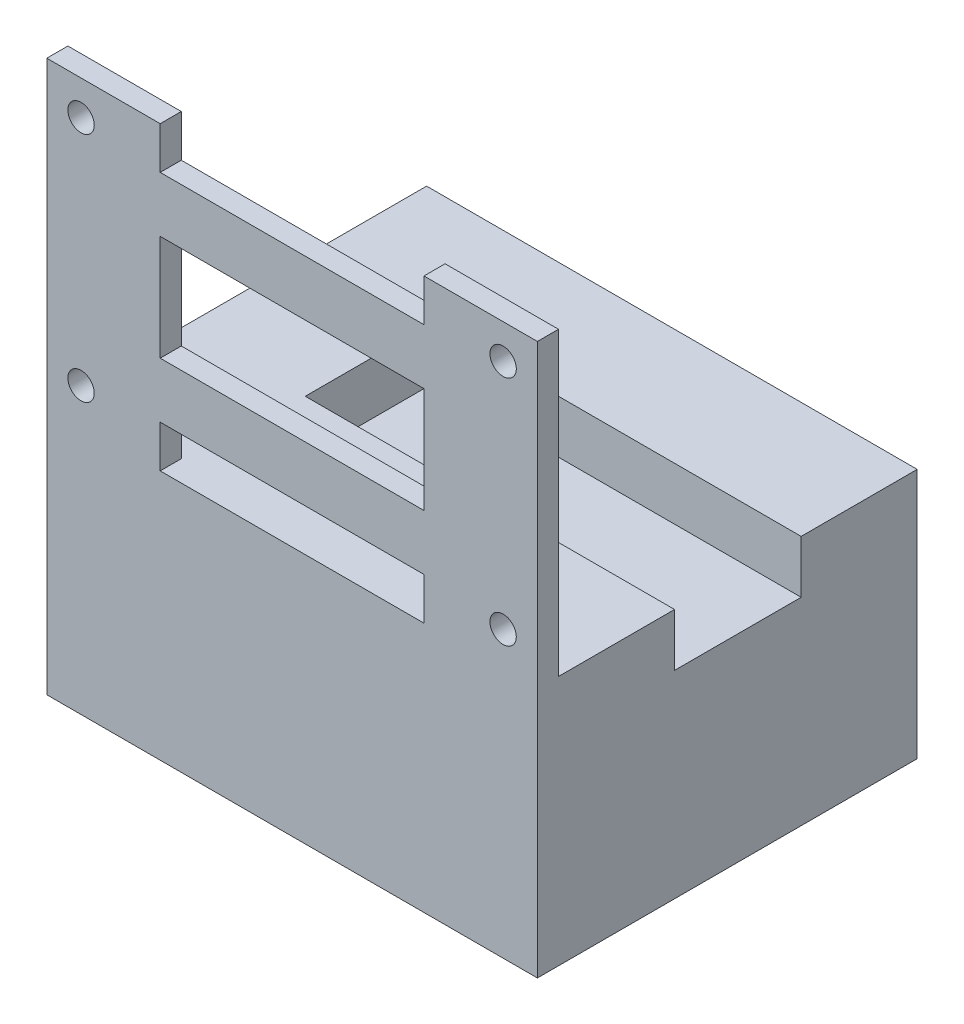
ISO-10303-21;
HEADER;
FILE_DESCRIPTION(('STEP AP214'),'2;1');
FILE_NAME('part.step','',(''),(''),'','','');
FILE_SCHEMA(('AUTOMOTIVE_DESIGN { 1 0 10303 214 1 1 1 1 }'));
ENDSEC;
DATA;
#1=APPLICATION_CONTEXT('core data for automotive mechanical design processes');
#2=APPLICATION_PROTOCOL_DEFINITION('international standard','automotive_design',2000,#1);
#3=PRODUCT_CONTEXT('',#1,'mechanical');
#4=PRODUCT('Part','Part','',(#3));
#5=PRODUCT_RELATED_PRODUCT_CATEGORY('part','',(#4));
#6=PRODUCT_DEFINITION_FORMATION('','',#4);
#7=PRODUCT_DEFINITION_CONTEXT('part definition',#1,'design');
#8=PRODUCT_DEFINITION('design','',#6,#7);
#9=PRODUCT_DEFINITION_SHAPE('','',#8);
#10=(LENGTH_UNIT() NAMED_UNIT(*) SI_UNIT(.MILLI.,.METRE.));
#11=(NAMED_UNIT(*) PLANE_ANGLE_UNIT() SI_UNIT($,.RADIAN.));
#12=(NAMED_UNIT(*) SI_UNIT($,.STERADIAN.) SOLID_ANGLE_UNIT());
#13=UNCERTAINTY_MEASURE_WITH_UNIT(LENGTH_MEASURE(1.E-05),#10,'distance_accuracy_value','');
#14=(GEOMETRIC_REPRESENTATION_CONTEXT(3) GLOBAL_UNCERTAINTY_ASSIGNED_CONTEXT((#13)) GLOBAL_UNIT_ASSIGNED_CONTEXT((#10,
#11,#12)) REPRESENTATION_CONTEXT('',''));
#15=CARTESIAN_POINT('',(0.,0.,0.));
#16=DIRECTION('',(0.,0.,1.));
#17=DIRECTION('',(1.,0.,0.));
#18=AXIS2_PLACEMENT_3D('',#15,#16,#17);
#19=CARTESIAN_POINT('',(-23.25,42.25,19.));
#20=DIRECTION('',(0.,-1.,0.));
#21=DIRECTION('',(0.,0.,-1.));
#22=AXIS2_PLACEMENT_3D('',#19,#20,#21);
#23=PLANE('',#22);
#24=DIRECTION('',(-1.,0.,0.));
#25=VECTOR('',#24,1.);
#26=CARTESIAN_POINT('',(-23.25,42.25,17.));
#27=LINE('',#26,#25);
#28=CARTESIAN_POINT('',(23.25,42.25,17.));
#29=VERTEX_POINT('',#28);
#30=CARTESIAN_POINT('',(12.5,42.25,17.));
#31=VERTEX_POINT('',#30);
#32=EDGE_CURVE('E455',#29,#31,#27,.T.);
#33=ORIENTED_EDGE('',*,*,#32,.T.);
#34=DIRECTION('',(0.,0.,-1.));
#35=VECTOR('',#34,1.);
#36=CARTESIAN_POINT('',(12.5,42.25,27.));
#37=LINE('',#36,#35);
#38=CARTESIAN_POINT('',(12.5,42.25,19.));
#39=VERTEX_POINT('',#38);
#40=EDGE_CURVE('E275',#39,#31,#37,.T.);
#41=ORIENTED_EDGE('',*,*,#40,.F.);
#42=DIRECTION('',(-1.,0.,0.));
#43=VECTOR('',#42,1.);
#44=CARTESIAN_POINT('',(-23.25,42.25,19.));
#45=LINE('',#44,#43);
#46=CARTESIAN_POINT('',(23.25,42.25,19.));
#47=VERTEX_POINT('',#46);
#48=EDGE_CURVE('E459',#47,#39,#45,.T.);
#49=ORIENTED_EDGE('',*,*,#48,.F.);
#50=DIRECTION('',(0.,0.,-1.));
#51=VECTOR('',#50,1.);
#52=CARTESIAN_POINT('',(23.25,42.25,19.));
#53=LINE('',#52,#51);
#54=EDGE_CURVE('E476',#47,#29,#53,.T.);
#55=ORIENTED_EDGE('',*,*,#54,.T.);
#56=EDGE_LOOP('',(#33,#41,#49,#55));
#57=FACE_BOUND('',#56,.T.);
#58=ADVANCED_FACE('F39',(#57),#23,.F.);
#59=CARTESIAN_POINT('',(23.25,13.75,17.));
#60=DIRECTION('',(-1.,0.,0.));
#61=DIRECTION('',(0.,0.,1.));
#62=AXIS2_PLACEMENT_3D('',#59,#60,#61);
#63=PLANE('',#62);
#64=DIRECTION('',(0.,0.,-1.));
#65=VECTOR('',#64,1.);
#66=CARTESIAN_POINT('',(23.25,8.75,-6.));
#67=LINE('',#66,#65);
#68=CARTESIAN_POINT('',(23.25,8.75,6.));
#69=VERTEX_POINT('',#68);
#70=CARTESIAN_POINT('',(23.25,8.75,-6.));
#71=VERTEX_POINT('',#70);
#72=EDGE_CURVE('E335',#69,#71,#67,.T.);
#73=ORIENTED_EDGE('',*,*,#72,.F.);
#74=DIRECTION('',(0.,1.,0.));
#75=VECTOR('',#74,1.);
#76=CARTESIAN_POINT('',(23.25,8.75,6.));
#77=LINE('',#76,#75);
#78=CARTESIAN_POINT('',(23.25,13.75,6.));
#79=VERTEX_POINT('',#78);
#80=EDGE_CURVE('E362',#69,#79,#77,.T.);
#81=ORIENTED_EDGE('',*,*,#80,.T.);
#82=DIRECTION('',(0.,0.,-1.));
#83=VECTOR('',#82,1.);
#84=CARTESIAN_POINT('',(23.25,13.75,17.));
#85=LINE('',#84,#83);
#86=CARTESIAN_POINT('',(23.25,13.75,17.));
#87=VERTEX_POINT('',#86);
#88=EDGE_CURVE('E481',#87,#79,#85,.T.);
#89=ORIENTED_EDGE('',*,*,#88,.F.);
#90=DIRECTION('',(0.,1.,0.));
#91=VECTOR('',#90,1.);
#92=CARTESIAN_POINT('',(23.25,0.,17.));
#93=LINE('',#92,#91);
#94=EDGE_CURVE('E466',#87,#29,#93,.T.);
#95=ORIENTED_EDGE('',*,*,#94,.T.);
#96=ORIENTED_EDGE('',*,*,#54,.F.);
#97=DIRECTION('',(0.,1.,0.));
#98=VECTOR('',#97,1.);
#99=CARTESIAN_POINT('',(23.25,0.,19.));
#100=LINE('',#99,#98);
#101=CARTESIAN_POINT('',(23.25,-10.,19.));
#102=VERTEX_POINT('',#101);
#103=EDGE_CURVE('E454',#102,#47,#100,.T.);
#104=ORIENTED_EDGE('',*,*,#103,.F.);
#105=DIRECTION('',(0.,0.,1.));
#106=VECTOR('',#105,1.);
#107=CARTESIAN_POINT('',(23.25,-10.,0.));
#108=LINE('',#107,#106);
#109=CARTESIAN_POINT('',(23.25,-10.,-17.));
#110=VERTEX_POINT('',#109);
#111=EDGE_CURVE('E308',#110,#102,#108,.T.);
#112=ORIENTED_EDGE('',*,*,#111,.F.);
#113=DIRECTION('',(0.,-1.,0.));
#114=VECTOR('',#113,1.);
#115=CARTESIAN_POINT('',(23.25,13.75,-17.));
#116=LINE('',#115,#114);
#117=CARTESIAN_POINT('',(23.25,13.75,-17.));
#118=VERTEX_POINT('',#117);
#119=EDGE_CURVE('E222',#118,#110,#116,.T.);
#120=ORIENTED_EDGE('',*,*,#119,.F.);
#121=CARTESIAN_POINT('',(23.25,13.75,-6.));
#122=VERTEX_POINT('',#121);
#123=EDGE_CURVE('E480',#122,#118,#85,.T.);
#124=ORIENTED_EDGE('',*,*,#123,.F.);
#125=DIRECTION('',(0.,1.,0.));
#126=VECTOR('',#125,1.);
#127=CARTESIAN_POINT('',(23.25,8.75,-6.));
#128=LINE('',#127,#126);
#129=EDGE_CURVE('E352',#71,#122,#128,.T.);
#130=ORIENTED_EDGE('',*,*,#129,.F.);
#131=EDGE_LOOP('',(#73,#81,#89,#95,#96,#104,#112,#120,#124,#130));
#132=FACE_BOUND('',#131,.T.);
#133=ADVANCED_FACE('F41',(#132),#63,.F.);
#134=CARTESIAN_POINT('',(-23.25,13.75,-17.));
#135=DIRECTION('',(0.,0.,1.));
#136=DIRECTION('',(1.,0.,0.));
#137=AXIS2_PLACEMENT_3D('',#134,#135,#136);
#138=PLANE('',#137);
#139=ORIENTED_EDGE('',*,*,#119,.T.);
#140=DIRECTION('',(1.,0.,0.));
#141=VECTOR('',#140,1.);
#142=CARTESIAN_POINT('',(0.,-10.,-17.));
#143=LINE('',#142,#141);
#144=CARTESIAN_POINT('',(-23.25,-10.,-17.));
#145=VERTEX_POINT('',#144);
#146=EDGE_CURVE('E304',#145,#110,#143,.T.);
#147=ORIENTED_EDGE('',*,*,#146,.F.);
#148=DIRECTION('',(0.,-1.,0.));
#149=VECTOR('',#148,1.);
#150=CARTESIAN_POINT('',(-23.25,13.75,-17.));
#151=LINE('',#150,#149);
#152=CARTESIAN_POINT('',(-23.25,13.75,-17.));
#153=VERTEX_POINT('',#152);
#154=EDGE_CURVE('E217',#153,#145,#151,.T.);
#155=ORIENTED_EDGE('',*,*,#154,.F.);
#156=DIRECTION('',(-1.,0.,0.));
#157=VECTOR('',#156,1.);
#158=CARTESIAN_POINT('',(-23.25,13.75,-17.));
#159=LINE('',#158,#157);
#160=EDGE_CURVE('E483',#118,#153,#159,.T.);
#161=ORIENTED_EDGE('',*,*,#160,.F.);
#162=EDGE_LOOP('',(#139,#147,#155,#161));
#163=FACE_BOUND('',#162,.T.);
#164=ADVANCED_FACE('F493',(#163),#138,.F.);
#165=CARTESIAN_POINT('',(-23.25,13.75,17.));
#166=DIRECTION('',(1.,0.,0.));
#167=DIRECTION('',(0.,0.,-1.));
#168=AXIS2_PLACEMENT_3D('',#165,#166,#167);
#169=PLANE('',#168);
#170=ORIENTED_EDGE('',*,*,#154,.T.);
#171=DIRECTION('',(0.,0.,-1.));
#172=VECTOR('',#171,1.);
#173=CARTESIAN_POINT('',(-23.25,-10.,0.));
#174=LINE('',#173,#172);
#175=CARTESIAN_POINT('',(-23.25,-10.,19.));
#176=VERTEX_POINT('',#175);
#177=EDGE_CURVE('E316',#176,#145,#174,.T.);
#178=ORIENTED_EDGE('',*,*,#177,.F.);
#179=DIRECTION('',(0.,-1.,0.));
#180=VECTOR('',#179,1.);
#181=CARTESIAN_POINT('',(-23.25,0.,19.));
#182=LINE('',#181,#180);
#183=CARTESIAN_POINT('',(-23.25,42.25,19.));
#184=VERTEX_POINT('',#183);
#185=EDGE_CURVE('E451',#184,#176,#182,.T.);
#186=ORIENTED_EDGE('',*,*,#185,.F.);
#187=DIRECTION('',(0.,0.,-1.));
#188=VECTOR('',#187,1.);
#189=CARTESIAN_POINT('',(-23.25,42.25,19.));
#190=LINE('',#189,#188);
#191=CARTESIAN_POINT('',(-23.25,42.25,17.));
#192=VERTEX_POINT('',#191);
#193=EDGE_CURVE('E463',#184,#192,#190,.T.);
#194=ORIENTED_EDGE('',*,*,#193,.T.);
#195=DIRECTION('',(0.,-1.,0.));
#196=VECTOR('',#195,1.);
#197=CARTESIAN_POINT('',(-23.25,0.,17.));
#198=LINE('',#197,#196);
#199=CARTESIAN_POINT('',(-23.25,13.75,17.));
#200=VERTEX_POINT('',#199);
#201=EDGE_CURVE('E447',#192,#200,#198,.T.);
#202=ORIENTED_EDGE('',*,*,#201,.T.);
#203=DIRECTION('',(0.,0.,1.));
#204=VECTOR('',#203,1.);
#205=CARTESIAN_POINT('',(-23.25,13.75,17.));
#206=LINE('',#205,#204);
#207=EDGE_CURVE('E215',#153,#200,#206,.T.);
#208=ORIENTED_EDGE('',*,*,#207,.F.);
#209=EDGE_LOOP('',(#170,#178,#186,#194,#202,#208));
#210=FACE_BOUND('',#209,.T.);
#211=ADVANCED_FACE('F496',(#210),#169,.F.);
#212=CARTESIAN_POINT('',(0.,13.75,0.));
#213=DIRECTION('',(0.,-1.,0.));
#214=DIRECTION('',(0.,0.,-1.));
#215=AXIS2_PLACEMENT_3D('',#212,#213,#214);
#216=PLANE('',#215);
#217=ORIENTED_EDGE('',*,*,#88,.T.);
#218=DIRECTION('',(1.,0.,0.));
#219=VECTOR('',#218,1.);
#220=CARTESIAN_POINT('',(23.25,13.75,6.));
#221=LINE('',#220,#219);
#222=CARTESIAN_POINT('',(-11.75,13.75,6.00000000000001));
#223=VERTEX_POINT('',#222);
#224=EDGE_CURVE('E340',#223,#79,#221,.T.);
#225=ORIENTED_EDGE('',*,*,#224,.F.);
#226=DIRECTION('',(0.,0.,1.));
#227=VECTOR('',#226,1.);
#228=CARTESIAN_POINT('',(-11.75,13.75,-5.99999999999999));
#229=LINE('',#228,#227);
#230=CARTESIAN_POINT('',(-11.75,13.75,-5.99999999999999));
#231=VERTEX_POINT('',#230);
#232=EDGE_CURVE('E356',#231,#223,#229,.T.);
#233=ORIENTED_EDGE('',*,*,#232,.F.);
#234=DIRECTION('',(-1.,0.,0.));
#235=VECTOR('',#234,1.);
#236=CARTESIAN_POINT('',(23.25,13.75,-6.));
#237=LINE('',#236,#235);
#238=EDGE_CURVE('E320',#122,#231,#237,.T.);
#239=ORIENTED_EDGE('',*,*,#238,.F.);
#240=ORIENTED_EDGE('',*,*,#123,.T.);
#241=ORIENTED_EDGE('',*,*,#160,.T.);
#242=ORIENTED_EDGE('',*,*,#207,.T.);
#243=DIRECTION('',(1.,0.,0.));
#244=VECTOR('',#243,1.);
#245=CARTESIAN_POINT('',(-23.25,13.75,17.));
#246=LINE('',#245,#244);
#247=CARTESIAN_POINT('',(-12.5,13.75,17.));
#248=VERTEX_POINT('',#247);
#249=EDGE_CURVE('E205',#200,#248,#246,.T.);
#250=ORIENTED_EDGE('',*,*,#249,.T.);
#251=DIRECTION('',(0.,0.,-1.));
#252=VECTOR('',#251,1.);
#253=CARTESIAN_POINT('',(-12.5,13.75,27.));
#254=LINE('',#253,#252);
#255=CARTESIAN_POINT('',(-12.5,13.75,19.));
#256=VERTEX_POINT('',#255);
#257=EDGE_CURVE('E63',#256,#248,#254,.T.);
#258=ORIENTED_EDGE('',*,*,#257,.F.);
#259=DIRECTION('',(-1.,0.,0.));
#260=VECTOR('',#259,1.);
#261=CARTESIAN_POINT('',(0.,13.75,19.));
#262=LINE('',#261,#260);
#263=CARTESIAN_POINT('',(12.5,13.75,19.));
#264=VERTEX_POINT('',#263);
#265=EDGE_CURVE('E241',#264,#256,#262,.T.);
#266=ORIENTED_EDGE('',*,*,#265,.F.);
#267=DIRECTION('',(0.,0.,-1.));
#268=VECTOR('',#267,1.);
#269=CARTESIAN_POINT('',(12.5,13.75,27.));
#270=LINE('',#269,#268);
#271=CARTESIAN_POINT('',(12.5,13.75,17.));
#272=VERTEX_POINT('',#271);
#273=EDGE_CURVE('E199',#264,#272,#270,.T.);
#274=ORIENTED_EDGE('',*,*,#273,.T.);
#275=EDGE_CURVE('E218',#272,#87,#246,.T.);
#276=ORIENTED_EDGE('',*,*,#275,.T.);
#277=EDGE_LOOP('',(#217,#225,#233,#239,#240,#241,#242,#250,#258,#266,#274,#276));
#278=FACE_BOUND('',#277,.T.);
#279=ADVANCED_FACE('F213',(#278),#216,.F.);
#280=CARTESIAN_POINT('',(0.,0.,17.));
#281=DIRECTION('',(0.,0.,-1.));
#282=DIRECTION('',(-1.,0.,0.));
#283=AXIS2_PLACEMENT_3D('',#280,#281,#282);
#284=PLANE('',#283);
#285=DIRECTION('',(0.,-1.,0.));
#286=VECTOR('',#285,1.);
#287=CARTESIAN_POINT('',(12.5,13.75,17.));
#288=LINE('',#287,#286);
#289=CARTESIAN_POINT('',(12.5,17.75,17.));
#290=VERTEX_POINT('',#289);
#291=EDGE_CURVE('E55',#290,#272,#288,.T.);
#292=ORIENTED_EDGE('',*,*,#291,.F.);
#293=DIRECTION('',(1.,0.,0.));
#294=VECTOR('',#293,1.);
#295=CARTESIAN_POINT('',(12.5,17.75,17.));
#296=LINE('',#295,#294);
#297=CARTESIAN_POINT('',(-12.5,17.75,17.));
#298=VERTEX_POINT('',#297);
#299=EDGE_CURVE('E208',#298,#290,#296,.T.);
#300=ORIENTED_EDGE('',*,*,#299,.F.);
#301=DIRECTION('',(0.,1.,0.));
#302=VECTOR('',#301,1.);
#303=CARTESIAN_POINT('',(-12.5,13.75,17.));
#304=LINE('',#303,#302);
#305=EDGE_CURVE('E192',#248,#298,#304,.T.);
#306=ORIENTED_EDGE('',*,*,#305,.F.);
#307=ORIENTED_EDGE('',*,*,#249,.F.);
#308=ORIENTED_EDGE('',*,*,#201,.F.);
#309=CARTESIAN_POINT('',(-12.5,42.25,17.));
#310=VERTEX_POINT('',#309);
#311=EDGE_CURVE('E469',#310,#192,#27,.T.);
#312=ORIENTED_EDGE('',*,*,#311,.F.);
#313=DIRECTION('',(0.,1.,0.));
#314=VECTOR('',#313,1.);
#315=CARTESIAN_POINT('',(-12.5,42.25,17.));
#316=LINE('',#315,#314);
#317=CARTESIAN_POINT('',(-12.5,38.25,17.));
#318=VERTEX_POINT('',#317);
#319=EDGE_CURVE('E271',#318,#310,#316,.T.);
#320=ORIENTED_EDGE('',*,*,#319,.F.);
#321=DIRECTION('',(-1.,0.,0.));
#322=VECTOR('',#321,1.);
#323=CARTESIAN_POINT('',(12.5,38.25,17.));
#324=LINE('',#323,#322);
#325=CARTESIAN_POINT('',(12.5,38.25,17.));
#326=VERTEX_POINT('',#325);
#327=EDGE_CURVE('E267',#326,#318,#324,.T.);
#328=ORIENTED_EDGE('',*,*,#327,.F.);
#329=DIRECTION('',(0.,-1.,0.));
#330=VECTOR('',#329,1.);
#331=CARTESIAN_POINT('',(12.5,42.25,17.));
#332=LINE('',#331,#330);
#333=EDGE_CURVE('E263',#31,#326,#332,.T.);
#334=ORIENTED_EDGE('',*,*,#333,.F.);
#335=ORIENTED_EDGE('',*,*,#32,.F.);
#336=ORIENTED_EDGE('',*,*,#94,.F.);
#337=ORIENTED_EDGE('',*,*,#275,.F.);
#338=EDGE_LOOP('',(#292,#300,#306,#307,#308,#312,#320,#328,#334,#335,#336,#337));
#339=FACE_BOUND('',#338,.T.);
#340=DIRECTION('',(0.,-1.,0.));
#341=VECTOR('',#340,1.);
#342=CARTESIAN_POINT('',(-12.5,33.,17.));
#343=LINE('',#342,#341);
#344=CARTESIAN_POINT('',(-12.5,33.,17.));
#345=VERTEX_POINT('',#344);
#346=CARTESIAN_POINT('',(-12.5,23.,17.));
#347=VERTEX_POINT('',#346);
#348=EDGE_CURVE('E408',#345,#347,#343,.T.);
#349=ORIENTED_EDGE('',*,*,#348,.T.);
#350=DIRECTION('',(1.,0.,0.));
#351=VECTOR('',#350,1.);
#352=CARTESIAN_POINT('',(-12.5,23.,17.));
#353=LINE('',#352,#351);
#354=CARTESIAN_POINT('',(12.5,23.,17.));
#355=VERTEX_POINT('',#354);
#356=EDGE_CURVE('E400',#347,#355,#353,.T.);
#357=ORIENTED_EDGE('',*,*,#356,.T.);
#358=DIRECTION('',(0.,1.,0.));
#359=VECTOR('',#358,1.);
#360=CARTESIAN_POINT('',(12.5,33.,17.));
#361=LINE('',#360,#359);
#362=CARTESIAN_POINT('',(12.5,33.,17.));
#363=VERTEX_POINT('',#362);
#364=EDGE_CURVE('E366',#355,#363,#361,.T.);
#365=ORIENTED_EDGE('',*,*,#364,.T.);
#366=DIRECTION('',(-1.,0.,0.));
#367=VECTOR('',#366,1.);
#368=CARTESIAN_POINT('',(-12.5,33.,17.));
#369=LINE('',#368,#367);
#370=EDGE_CURVE('E404',#363,#345,#369,.T.);
#371=ORIENTED_EDGE('',*,*,#370,.T.);
#372=EDGE_LOOP('',(#349,#357,#365,#371));
#373=FACE_BOUND('',#372,.T.);
#374=CARTESIAN_POINT('',(-20.,17.,17.));
#375=DIRECTION('',(0.,0.,-1.));
#376=DIRECTION('',(-1.,0.,0.));
#377=AXIS2_PLACEMENT_3D('',#374,#375,#376);
#378=CIRCLE('',#377,1.25);
#379=CARTESIAN_POINT('',(-21.25,17.,17.));
#380=VERTEX_POINT('',#379);
#381=EDGE_CURVE('E396',#380,#380,#378,.F.);
#382=ORIENTED_EDGE('',*,*,#381,.T.);
#383=EDGE_LOOP('',(#382));
#384=FACE_BOUND('',#383,.T.);
#385=CARTESIAN_POINT('',(20.,39.,17.));
#386=DIRECTION('',(0.,0.,-1.));
#387=DIRECTION('',(-1.,0.,0.));
#388=AXIS2_PLACEMENT_3D('',#385,#386,#387);
#389=CIRCLE('',#388,1.25);
#390=CARTESIAN_POINT('',(18.75,39.,17.));
#391=VERTEX_POINT('',#390);
#392=EDGE_CURVE('E388',#391,#391,#389,.F.);
#393=ORIENTED_EDGE('',*,*,#392,.T.);
#394=EDGE_LOOP('',(#393));
#395=FACE_BOUND('',#394,.T.);
#396=CARTESIAN_POINT('',(20.,17.,17.));
#397=DIRECTION('',(0.,0.,-1.));
#398=DIRECTION('',(-1.,0.,0.));
#399=AXIS2_PLACEMENT_3D('',#396,#397,#398);
#400=CIRCLE('',#399,1.25);
#401=CARTESIAN_POINT('',(18.75,17.,17.));
#402=VERTEX_POINT('',#401);
#403=EDGE_CURVE('E380',#402,#402,#400,.F.);
#404=ORIENTED_EDGE('',*,*,#403,.T.);
#405=EDGE_LOOP('',(#404));
#406=FACE_BOUND('',#405,.T.);
#407=CARTESIAN_POINT('',(-20.,39.,17.));
#408=DIRECTION('',(0.,0.,-1.));
#409=DIRECTION('',(-1.,0.,0.));
#410=AXIS2_PLACEMENT_3D('',#407,#408,#409);
#411=CIRCLE('',#410,1.25);
#412=CARTESIAN_POINT('',(-21.25,39.,17.));
#413=VERTEX_POINT('',#412);
#414=EDGE_CURVE('E379',#413,#413,#411,.F.);
#415=ORIENTED_EDGE('',*,*,#414,.T.);
#416=EDGE_LOOP('',(#415));
#417=FACE_BOUND('',#416,.T.);
#418=ADVANCED_FACE('F202',(#339,#373,#384,#395,#406,#417),#284,.T.);
#419=CARTESIAN_POINT('',(-12.5,42.25,19.));
#420=VERTEX_POINT('',#419);
#421=EDGE_CURVE('E458',#420,#184,#45,.T.);
#422=ORIENTED_EDGE('',*,*,#421,.F.);
#423=DIRECTION('',(0.,0.,-1.));
#424=VECTOR('',#423,1.);
#425=CARTESIAN_POINT('',(-12.5,42.25,27.));
#426=LINE('',#425,#424);
#427=EDGE_CURVE('E278',#420,#310,#426,.T.);
#428=ORIENTED_EDGE('',*,*,#427,.T.);
#429=ORIENTED_EDGE('',*,*,#311,.T.);
#430=ORIENTED_EDGE('',*,*,#193,.F.);
#431=EDGE_LOOP('',(#422,#428,#429,#430));
#432=FACE_BOUND('',#431,.T.);
#433=ADVANCED_FACE('F510',(#432),#23,.F.);
#434=CARTESIAN_POINT('',(0.,0.,19.));
#435=DIRECTION('',(0.,0.,-1.));
#436=DIRECTION('',(-1.,0.,0.));
#437=AXIS2_PLACEMENT_3D('',#434,#435,#436);
#438=PLANE('',#437);
#439=DIRECTION('',(1.,0.,0.));
#440=VECTOR('',#439,1.);
#441=CARTESIAN_POINT('',(0.,17.75,19.));
#442=LINE('',#441,#440);
#443=CARTESIAN_POINT('',(-12.5,17.75,19.));
#444=VERTEX_POINT('',#443);
#445=CARTESIAN_POINT('',(12.5,17.75,19.));
#446=VERTEX_POINT('',#445);
#447=EDGE_CURVE('E48',#444,#446,#442,.T.);
#448=ORIENTED_EDGE('',*,*,#447,.T.);
#449=DIRECTION('',(0.,-1.,0.));
#450=VECTOR('',#449,1.);
#451=CARTESIAN_POINT('',(12.5,0.,19.));
#452=LINE('',#451,#450);
#453=EDGE_CURVE('E11',#446,#264,#452,.T.);
#454=ORIENTED_EDGE('',*,*,#453,.T.);
#455=ORIENTED_EDGE('',*,*,#265,.T.);
#456=DIRECTION('',(0.,1.,0.));
#457=VECTOR('',#456,1.);
#458=CARTESIAN_POINT('',(-12.5,0.,19.));
#459=LINE('',#458,#457);
#460=EDGE_CURVE('E195',#256,#444,#459,.T.);
#461=ORIENTED_EDGE('',*,*,#460,.T.);
#462=EDGE_LOOP('',(#448,#454,#455,#461));
#463=FACE_BOUND('',#462,.T.);
#464=ORIENTED_EDGE('',*,*,#48,.T.);
#465=DIRECTION('',(0.,-1.,0.));
#466=VECTOR('',#465,1.);
#467=CARTESIAN_POINT('',(12.5,0.,19.));
#468=LINE('',#467,#466);
#469=CARTESIAN_POINT('',(12.5,38.25,19.));
#470=VERTEX_POINT('',#469);
#471=EDGE_CURVE('E237',#39,#470,#468,.T.);
#472=ORIENTED_EDGE('',*,*,#471,.T.);
#473=DIRECTION('',(-1.,0.,0.));
#474=VECTOR('',#473,1.);
#475=CARTESIAN_POINT('',(0.,38.25,19.));
#476=LINE('',#475,#474);
#477=CARTESIAN_POINT('',(-12.5,38.25,19.));
#478=VERTEX_POINT('',#477);
#479=EDGE_CURVE('E229',#470,#478,#476,.T.);
#480=ORIENTED_EDGE('',*,*,#479,.T.);
#481=DIRECTION('',(0.,1.,0.));
#482=VECTOR('',#481,1.);
#483=CARTESIAN_POINT('',(-12.5,0.,19.));
#484=LINE('',#483,#482);
#485=EDGE_CURVE('E233',#478,#420,#484,.T.);
#486=ORIENTED_EDGE('',*,*,#485,.T.);
#487=ORIENTED_EDGE('',*,*,#421,.T.);
#488=ORIENTED_EDGE('',*,*,#185,.T.);
#489=DIRECTION('',(-1.,0.,0.));
#490=VECTOR('',#489,1.);
#491=CARTESIAN_POINT('',(0.,-10.,19.));
#492=LINE('',#491,#490);
#493=EDGE_CURVE('E312',#102,#176,#492,.T.);
#494=ORIENTED_EDGE('',*,*,#493,.F.);
#495=ORIENTED_EDGE('',*,*,#103,.T.);
#496=EDGE_LOOP('',(#464,#472,#480,#486,#487,#488,#494,#495));
#497=FACE_BOUND('',#496,.T.);
#498=DIRECTION('',(1.,0.,0.));
#499=VECTOR('',#498,1.);
#500=CARTESIAN_POINT('',(-12.5,23.,19.));
#501=LINE('',#500,#499);
#502=CARTESIAN_POINT('',(-12.5,23.,19.));
#503=VERTEX_POINT('',#502);
#504=CARTESIAN_POINT('',(12.5,23.,19.));
#505=VERTEX_POINT('',#504);
#506=EDGE_CURVE('E415',#503,#505,#501,.T.);
#507=ORIENTED_EDGE('',*,*,#506,.F.);
#508=DIRECTION('',(0.,-1.,0.));
#509=VECTOR('',#508,1.);
#510=CARTESIAN_POINT('',(-12.5,33.,19.));
#511=LINE('',#510,#509);
#512=CARTESIAN_POINT('',(-12.5,33.,19.));
#513=VERTEX_POINT('',#512);
#514=EDGE_CURVE('E412',#513,#503,#511,.T.);
#515=ORIENTED_EDGE('',*,*,#514,.F.);
#516=DIRECTION('',(-1.,0.,0.));
#517=VECTOR('',#516,1.);
#518=CARTESIAN_POINT('',(-12.5,33.,19.));
#519=LINE('',#518,#517);
#520=CARTESIAN_POINT('',(12.5,33.,19.));
#521=VERTEX_POINT('',#520);
#522=EDGE_CURVE('E423',#521,#513,#519,.T.);
#523=ORIENTED_EDGE('',*,*,#522,.F.);
#524=DIRECTION('',(0.,1.,0.));
#525=VECTOR('',#524,1.);
#526=CARTESIAN_POINT('',(12.5,33.,19.));
#527=LINE('',#526,#525);
#528=EDGE_CURVE('E419',#505,#521,#527,.T.);
#529=ORIENTED_EDGE('',*,*,#528,.F.);
#530=EDGE_LOOP('',(#507,#515,#523,#529));
#531=FACE_BOUND('',#530,.T.);
#532=CARTESIAN_POINT('',(-20.,17.,19.));
#533=DIRECTION('',(0.,0.,1.));
#534=DIRECTION('',(-1.,0.,0.));
#535=AXIS2_PLACEMENT_3D('',#532,#533,#534);
#536=CIRCLE('',#535,1.25);
#537=CARTESIAN_POINT('',(-21.25,17.,19.));
#538=VERTEX_POINT('',#537);
#539=EDGE_CURVE('E392',#538,#538,#536,.T.);
#540=ORIENTED_EDGE('',*,*,#539,.F.);
#541=EDGE_LOOP('',(#540));
#542=FACE_BOUND('',#541,.T.);
#543=CARTESIAN_POINT('',(20.,39.,19.));
#544=DIRECTION('',(0.,0.,1.));
#545=DIRECTION('',(-1.,0.,0.));
#546=AXIS2_PLACEMENT_3D('',#543,#544,#545);
#547=CIRCLE('',#546,1.25);
#548=CARTESIAN_POINT('',(18.75,39.,19.));
#549=VERTEX_POINT('',#548);
#550=EDGE_CURVE('E384',#549,#549,#547,.T.);
#551=ORIENTED_EDGE('',*,*,#550,.F.);
#552=EDGE_LOOP('',(#551));
#553=FACE_BOUND('',#552,.T.);
#554=CARTESIAN_POINT('',(20.,17.,19.));
#555=DIRECTION('',(0.,0.,1.));
#556=DIRECTION('',(1.,0.,0.));
#557=AXIS2_PLACEMENT_3D('',#554,#555,#556);
#558=CIRCLE('',#557,1.25);
#559=CARTESIAN_POINT('',(21.25,17.,19.));
#560=VERTEX_POINT('',#559);
#561=EDGE_CURVE('E375',#560,#560,#558,.T.);
#562=ORIENTED_EDGE('',*,*,#561,.F.);
#563=EDGE_LOOP('',(#562));
#564=FACE_BOUND('',#563,.T.);
#565=CARTESIAN_POINT('',(-20.,39.,19.));
#566=DIRECTION('',(0.,0.,1.));
#567=DIRECTION('',(1.,0.,0.));
#568=AXIS2_PLACEMENT_3D('',#565,#566,#567);
#569=CIRCLE('',#568,1.25);
#570=CARTESIAN_POINT('',(-18.75,39.,19.));
#571=VERTEX_POINT('',#570);
#572=EDGE_CURVE('E443',#571,#571,#569,.T.);
#573=ORIENTED_EDGE('',*,*,#572,.F.);
#574=EDGE_LOOP('',(#573));
#575=FACE_BOUND('',#574,.T.);
#576=ADVANCED_FACE('F248',(#463,#497,#531,#542,#553,#564,#575),#438,.F.);
#577=CARTESIAN_POINT('',(-20.,39.,-17.001));
#578=DIRECTION('',(0.,0.,1.));
#579=DIRECTION('',(1.,0.,0.));
#580=AXIS2_PLACEMENT_3D('',#577,#578,#579);
#581=CYLINDRICAL_SURFACE('',#580,1.25);
#582=ORIENTED_EDGE('',*,*,#414,.F.);
#583=EDGE_LOOP('',(#582));
#584=FACE_BOUND('',#583,.T.);
#585=ORIENTED_EDGE('',*,*,#572,.T.);
#586=EDGE_LOOP('',(#585));
#587=FACE_BOUND('',#586,.T.);
#588=ADVANCED_FACE('F556',(#584,#587),#581,.F.);
#589=CARTESIAN_POINT('',(20.,17.,-17.001));
#590=DIRECTION('',(0.,0.,1.));
#591=DIRECTION('',(1.,0.,0.));
#592=AXIS2_PLACEMENT_3D('',#589,#590,#591);
#593=CYLINDRICAL_SURFACE('',#592,1.25);
#594=ORIENTED_EDGE('',*,*,#403,.F.);
#595=EDGE_LOOP('',(#594));
#596=FACE_BOUND('',#595,.T.);
#597=ORIENTED_EDGE('',*,*,#561,.T.);
#598=EDGE_LOOP('',(#597));
#599=FACE_BOUND('',#598,.T.);
#600=ADVANCED_FACE('F564',(#596,#599),#593,.F.);
#601=CARTESIAN_POINT('',(20.,39.,-17.001));
#602=DIRECTION('',(0.,0.,1.));
#603=DIRECTION('',(1.,0.,0.));
#604=AXIS2_PLACEMENT_3D('',#601,#602,#603);
#605=CYLINDRICAL_SURFACE('',#604,1.25);
#606=ORIENTED_EDGE('',*,*,#392,.F.);
#607=EDGE_LOOP('',(#606));
#608=FACE_BOUND('',#607,.T.);
#609=ORIENTED_EDGE('',*,*,#550,.T.);
#610=EDGE_LOOP('',(#609));
#611=FACE_BOUND('',#610,.T.);
#612=ADVANCED_FACE('F586',(#608,#611),#605,.F.);
#613=CARTESIAN_POINT('',(-20.,17.,-17.001));
#614=DIRECTION('',(0.,0.,1.));
#615=DIRECTION('',(1.,0.,0.));
#616=AXIS2_PLACEMENT_3D('',#613,#614,#615);
#617=CYLINDRICAL_SURFACE('',#616,1.25);
#618=ORIENTED_EDGE('',*,*,#381,.F.);
#619=EDGE_LOOP('',(#618));
#620=FACE_BOUND('',#619,.T.);
#621=ORIENTED_EDGE('',*,*,#539,.T.);
#622=EDGE_LOOP('',(#621));
#623=FACE_BOUND('',#622,.T.);
#624=ADVANCED_FACE('F570',(#620,#623),#617,.F.);
#625=CARTESIAN_POINT('',(-12.5,33.,-17.001));
#626=DIRECTION('',(-1.,0.,0.));
#627=DIRECTION('',(0.,-1.,0.));
#628=AXIS2_PLACEMENT_3D('',#625,#626,#627);
#629=PLANE('',#628);
#630=DIRECTION('',(0.,0.,1.));
#631=VECTOR('',#630,1.);
#632=CARTESIAN_POINT('',(-12.5,33.,-17.001));
#633=LINE('',#632,#631);
#634=EDGE_CURVE('E428',#345,#513,#633,.T.);
#635=ORIENTED_EDGE('',*,*,#634,.T.);
#636=ORIENTED_EDGE('',*,*,#514,.T.);
#637=DIRECTION('',(0.,0.,1.));
#638=VECTOR('',#637,1.);
#639=CARTESIAN_POINT('',(-12.5,23.,-17.001));
#640=LINE('',#639,#638);
#641=EDGE_CURVE('E427',#347,#503,#640,.T.);
#642=ORIENTED_EDGE('',*,*,#641,.F.);
#643=ORIENTED_EDGE('',*,*,#348,.F.);
#644=EDGE_LOOP('',(#635,#636,#642,#643));
#645=FACE_BOUND('',#644,.T.);
#646=ADVANCED_FACE('F566',(#645),#629,.F.);
#647=CARTESIAN_POINT('',(-12.5,33.,-17.001));
#648=DIRECTION('',(0.,1.,0.));
#649=DIRECTION('',(0.,0.,1.));
#650=AXIS2_PLACEMENT_3D('',#647,#648,#649);
#651=PLANE('',#650);
#652=DIRECTION('',(0.,0.,1.));
#653=VECTOR('',#652,1.);
#654=CARTESIAN_POINT('',(12.5,33.,-17.001));
#655=LINE('',#654,#653);
#656=EDGE_CURVE('E431',#363,#521,#655,.T.);
#657=ORIENTED_EDGE('',*,*,#656,.T.);
#658=ORIENTED_EDGE('',*,*,#522,.T.);
#659=ORIENTED_EDGE('',*,*,#634,.F.);
#660=ORIENTED_EDGE('',*,*,#370,.F.);
#661=EDGE_LOOP('',(#657,#658,#659,#660));
#662=FACE_BOUND('',#661,.T.);
#663=ADVANCED_FACE('F569',(#662),#651,.F.);
#664=CARTESIAN_POINT('',(12.5,33.,-17.001));
#665=DIRECTION('',(1.,0.,0.));
#666=DIRECTION('',(0.,1.,0.));
#667=AXIS2_PLACEMENT_3D('',#664,#665,#666);
#668=PLANE('',#667);
#669=DIRECTION('',(0.,0.,1.));
#670=VECTOR('',#669,1.);
#671=CARTESIAN_POINT('',(12.5,23.,-17.001));
#672=LINE('',#671,#670);
#673=EDGE_CURVE('E434',#355,#505,#672,.T.);
#674=ORIENTED_EDGE('',*,*,#673,.T.);
#675=ORIENTED_EDGE('',*,*,#528,.T.);
#676=ORIENTED_EDGE('',*,*,#656,.F.);
#677=ORIENTED_EDGE('',*,*,#364,.F.);
#678=EDGE_LOOP('',(#674,#675,#676,#677));
#679=FACE_BOUND('',#678,.T.);
#680=ADVANCED_FACE('F576',(#679),#668,.F.);
#681=CARTESIAN_POINT('',(-12.5,23.,-17.001));
#682=DIRECTION('',(0.,-1.,0.));
#683=DIRECTION('',(0.,0.,-1.));
#684=AXIS2_PLACEMENT_3D('',#681,#682,#683);
#685=PLANE('',#684);
#686=ORIENTED_EDGE('',*,*,#641,.T.);
#687=ORIENTED_EDGE('',*,*,#506,.T.);
#688=ORIENTED_EDGE('',*,*,#673,.F.);
#689=ORIENTED_EDGE('',*,*,#356,.F.);
#690=EDGE_LOOP('',(#686,#687,#688,#689));
#691=FACE_BOUND('',#690,.T.);
#692=ADVANCED_FACE('F572',(#691),#685,.F.);
#693=CARTESIAN_POINT('',(23.25,8.75,6.));
#694=DIRECTION('',(0.,0.,1.));
#695=DIRECTION('',(1.,0.,0.));
#696=AXIS2_PLACEMENT_3D('',#693,#694,#695);
#697=PLANE('',#696);
#698=ORIENTED_EDGE('',*,*,#224,.T.);
#699=ORIENTED_EDGE('',*,*,#80,.F.);
#700=DIRECTION('',(1.,0.,0.));
#701=VECTOR('',#700,1.);
#702=CARTESIAN_POINT('',(23.25,8.75,6.));
#703=LINE('',#702,#701);
#704=CARTESIAN_POINT('',(-11.75,8.75,6.00000000000001));
#705=VERTEX_POINT('',#704);
#706=EDGE_CURVE('E348',#705,#69,#703,.T.);
#707=ORIENTED_EDGE('',*,*,#706,.F.);
#708=DIRECTION('',(0.,1.,0.));
#709=VECTOR('',#708,1.);
#710=CARTESIAN_POINT('',(-11.75,8.75,6.00000000000001));
#711=LINE('',#710,#709);
#712=EDGE_CURVE('E367',#705,#223,#711,.T.);
#713=ORIENTED_EDGE('',*,*,#712,.T.);
#714=EDGE_LOOP('',(#698,#699,#707,#713));
#715=FACE_BOUND('',#714,.T.);
#716=ADVANCED_FACE('F575',(#715),#697,.F.);
#717=CARTESIAN_POINT('',(-11.75,8.75,-5.99999999999999));
#718=DIRECTION('',(-1.,0.,0.));
#719=DIRECTION('',(0.,0.,1.));
#720=AXIS2_PLACEMENT_3D('',#717,#718,#719);
#721=PLANE('',#720);
#722=ORIENTED_EDGE('',*,*,#232,.T.);
#723=ORIENTED_EDGE('',*,*,#712,.F.);
#724=DIRECTION('',(0.,0.,1.));
#725=VECTOR('',#724,1.);
#726=CARTESIAN_POINT('',(-11.75,8.75,-5.99999999999999));
#727=LINE('',#726,#725);
#728=CARTESIAN_POINT('',(-11.75,8.75,-5.99999999999999));
#729=VERTEX_POINT('',#728);
#730=EDGE_CURVE('E344',#729,#705,#727,.T.);
#731=ORIENTED_EDGE('',*,*,#730,.F.);
#732=DIRECTION('',(0.,1.,0.));
#733=VECTOR('',#732,1.);
#734=CARTESIAN_POINT('',(-11.75,8.75,-5.99999999999999));
#735=LINE('',#734,#733);
#736=EDGE_CURVE('E370',#729,#231,#735,.T.);
#737=ORIENTED_EDGE('',*,*,#736,.T.);
#738=EDGE_LOOP('',(#722,#723,#731,#737));
#739=FACE_BOUND('',#738,.T.);
#740=ADVANCED_FACE('F598',(#739),#721,.F.);
#741=CARTESIAN_POINT('',(23.25,8.75,-6.));
#742=DIRECTION('',(0.,0.,-1.));
#743=DIRECTION('',(-1.,0.,0.));
#744=AXIS2_PLACEMENT_3D('',#741,#742,#743);
#745=PLANE('',#744);
#746=ORIENTED_EDGE('',*,*,#238,.T.);
#747=ORIENTED_EDGE('',*,*,#736,.F.);
#748=DIRECTION('',(-1.,0.,0.));
#749=VECTOR('',#748,1.);
#750=CARTESIAN_POINT('',(23.25,8.75,-6.));
#751=LINE('',#750,#749);
#752=EDGE_CURVE('E339',#71,#729,#751,.T.);
#753=ORIENTED_EDGE('',*,*,#752,.F.);
#754=ORIENTED_EDGE('',*,*,#129,.T.);
#755=EDGE_LOOP('',(#746,#747,#753,#754));
#756=FACE_BOUND('',#755,.T.);
#757=ADVANCED_FACE('F594',(#756),#745,.F.);
#758=CARTESIAN_POINT('',(0.,8.75,0.));
#759=DIRECTION('',(0.,-1.,0.));
#760=DIRECTION('',(0.,0.,-1.));
#761=AXIS2_PLACEMENT_3D('',#758,#759,#760);
#762=PLANE('',#761);
#763=ORIENTED_EDGE('',*,*,#72,.T.);
#764=ORIENTED_EDGE('',*,*,#752,.T.);
#765=ORIENTED_EDGE('',*,*,#730,.T.);
#766=ORIENTED_EDGE('',*,*,#706,.T.);
#767=EDGE_LOOP('',(#763,#764,#765,#766));
#768=FACE_BOUND('',#767,.T.);
#769=ADVANCED_FACE('F597',(#768),#762,.F.);
#770=CARTESIAN_POINT('',(16.25,-10.,-10.));
#771=DIRECTION('',(0.,1.,0.));
#772=DIRECTION('',(0.,0.,1.));
#773=AXIS2_PLACEMENT_3D('',#770,#771,#772);
#774=CYLINDRICAL_SURFACE('',#773,2.);
#775=CARTESIAN_POINT('',(16.25,-10.,-10.));
#776=DIRECTION('',(0.,-1.,0.));
#777=DIRECTION('',(0.,0.,-1.));
#778=AXIS2_PLACEMENT_3D('',#775,#776,#777);
#779=CIRCLE('',#778,2.);
#780=CARTESIAN_POINT('',(16.25,-10.,-12.));
#781=VERTEX_POINT('',#780);
#782=EDGE_CURVE('E300',#781,#781,#779,.T.);
#783=ORIENTED_EDGE('',*,*,#782,.T.);
#784=EDGE_LOOP('',(#783));
#785=FACE_BOUND('',#784,.T.);
#786=CARTESIAN_POINT('',(16.25,0.,-10.));
#787=DIRECTION('',(0.,-1.,0.));
#788=DIRECTION('',(0.,0.,-1.));
#789=AXIS2_PLACEMENT_3D('',#786,#787,#788);
#790=CIRCLE('',#789,2.);
#791=CARTESIAN_POINT('',(16.25,0.,-12.));
#792=VERTEX_POINT('',#791);
#793=EDGE_CURVE('E292',#792,#792,#790,.T.);
#794=ORIENTED_EDGE('',*,*,#793,.F.);
#795=EDGE_LOOP('',(#794));
#796=FACE_BOUND('',#795,.T.);
#797=ADVANCED_FACE('F608',(#785,#796),#774,.F.);
#798=CARTESIAN_POINT('',(16.25,-10.,12.));
#799=DIRECTION('',(0.,1.,0.));
#800=DIRECTION('',(0.,0.,1.));
#801=AXIS2_PLACEMENT_3D('',#798,#799,#800);
#802=CYLINDRICAL_SURFACE('',#801,2.);
#803=CARTESIAN_POINT('',(16.25,-10.,12.));
#804=DIRECTION('',(0.,-1.,0.));
#805=DIRECTION('',(0.,0.,-1.));
#806=AXIS2_PLACEMENT_3D('',#803,#804,#805);
#807=CIRCLE('',#806,2.);
#808=CARTESIAN_POINT('',(16.25,-10.,10.));
#809=VERTEX_POINT('',#808);
#810=EDGE_CURVE('E296',#809,#809,#807,.T.);
#811=ORIENTED_EDGE('',*,*,#810,.T.);
#812=EDGE_LOOP('',(#811));
#813=FACE_BOUND('',#812,.T.);
#814=CARTESIAN_POINT('',(16.25,0.,12.));
#815=DIRECTION('',(0.,-1.,0.));
#816=DIRECTION('',(0.,0.,-1.));
#817=AXIS2_PLACEMENT_3D('',#814,#815,#816);
#818=CIRCLE('',#817,2.);
#819=CARTESIAN_POINT('',(16.25,0.,10.));
#820=VERTEX_POINT('',#819);
#821=EDGE_CURVE('E328',#820,#820,#818,.T.);
#822=ORIENTED_EDGE('',*,*,#821,.F.);
#823=EDGE_LOOP('',(#822));
#824=FACE_BOUND('',#823,.T.);
#825=ADVANCED_FACE('F617',(#813,#824),#802,.F.);
#826=CARTESIAN_POINT('',(-16.25,-10.,-10.));
#827=DIRECTION('',(0.,1.,0.));
#828=DIRECTION('',(0.,0.,1.));
#829=AXIS2_PLACEMENT_3D('',#826,#827,#828);
#830=CYLINDRICAL_SURFACE('',#829,2.);
#831=CARTESIAN_POINT('',(-16.25,-10.,-10.));
#832=DIRECTION('',(0.,-1.,0.));
#833=DIRECTION('',(0.,0.,-1.));
#834=AXIS2_PLACEMENT_3D('',#831,#832,#833);
#835=CIRCLE('',#834,2.);
#836=CARTESIAN_POINT('',(-16.25,-10.,-12.));
#837=VERTEX_POINT('',#836);
#838=EDGE_CURVE('E291',#837,#837,#835,.T.);
#839=ORIENTED_EDGE('',*,*,#838,.T.);
#840=EDGE_LOOP('',(#839));
#841=FACE_BOUND('',#840,.T.);
#842=CARTESIAN_POINT('',(-16.25,0.,-10.));
#843=DIRECTION('',(0.,-1.,0.));
#844=DIRECTION('',(0.,0.,-1.));
#845=AXIS2_PLACEMENT_3D('',#842,#843,#844);
#846=CIRCLE('',#845,2.);
#847=CARTESIAN_POINT('',(-16.25,0.,-12.));
#848=VERTEX_POINT('',#847);
#849=EDGE_CURVE('E324',#848,#848,#846,.T.);
#850=ORIENTED_EDGE('',*,*,#849,.F.);
#851=EDGE_LOOP('',(#850));
#852=FACE_BOUND('',#851,.T.);
#853=ADVANCED_FACE('F613',(#841,#852),#830,.F.);
#854=CARTESIAN_POINT('',(-16.25,-10.,12.));
#855=DIRECTION('',(0.,1.,0.));
#856=DIRECTION('',(0.,0.,1.));
#857=AXIS2_PLACEMENT_3D('',#854,#855,#856);
#858=CYLINDRICAL_SURFACE('',#857,2.);
#859=CARTESIAN_POINT('',(-16.25,-10.,12.));
#860=DIRECTION('',(0.,-1.,0.));
#861=DIRECTION('',(0.,0.,-1.));
#862=AXIS2_PLACEMENT_3D('',#859,#860,#861);
#863=CIRCLE('',#862,2.);
#864=CARTESIAN_POINT('',(-16.25,-10.,10.));
#865=VERTEX_POINT('',#864);
#866=EDGE_CURVE('E287',#865,#865,#863,.T.);
#867=ORIENTED_EDGE('',*,*,#866,.T.);
#868=EDGE_LOOP('',(#867));
#869=FACE_BOUND('',#868,.T.);
#870=CARTESIAN_POINT('',(-16.25,0.,12.));
#871=DIRECTION('',(0.,-1.,0.));
#872=DIRECTION('',(0.,0.,-1.));
#873=AXIS2_PLACEMENT_3D('',#870,#871,#872);
#874=CIRCLE('',#873,2.);
#875=CARTESIAN_POINT('',(-16.25,0.,10.));
#876=VERTEX_POINT('',#875);
#877=EDGE_CURVE('E257',#876,#876,#874,.T.);
#878=ORIENTED_EDGE('',*,*,#877,.F.);
#879=EDGE_LOOP('',(#878));
#880=FACE_BOUND('',#879,.T.);
#881=ADVANCED_FACE('F610',(#869,#880),#858,.F.);
#882=CARTESIAN_POINT('',(0.,-10.,0.));
#883=DIRECTION('',(0.,-1.,0.));
#884=DIRECTION('',(0.,0.,-1.));
#885=AXIS2_PLACEMENT_3D('',#882,#883,#884);
#886=PLANE('',#885);
#887=ORIENTED_EDGE('',*,*,#866,.F.);
#888=EDGE_LOOP('',(#887));
#889=FACE_BOUND('',#888,.T.);
#890=ORIENTED_EDGE('',*,*,#838,.F.);
#891=EDGE_LOOP('',(#890));
#892=FACE_BOUND('',#891,.T.);
#893=ORIENTED_EDGE('',*,*,#810,.F.);
#894=EDGE_LOOP('',(#893));
#895=FACE_BOUND('',#894,.T.);
#896=ORIENTED_EDGE('',*,*,#782,.F.);
#897=EDGE_LOOP('',(#896));
#898=FACE_BOUND('',#897,.T.);
#899=ORIENTED_EDGE('',*,*,#146,.T.);
#900=ORIENTED_EDGE('',*,*,#111,.T.);
#901=ORIENTED_EDGE('',*,*,#493,.T.);
#902=ORIENTED_EDGE('',*,*,#177,.T.);
#903=EDGE_LOOP('',(#899,#900,#901,#902));
#904=FACE_BOUND('',#903,.T.);
#905=ADVANCED_FACE('F512',(#889,#892,#895,#898,#904),#886,.T.);
#906=CARTESIAN_POINT('',(0.,0.,0.));
#907=DIRECTION('',(0.,-1.,0.));
#908=DIRECTION('',(0.,0.,-1.));
#909=AXIS2_PLACEMENT_3D('',#906,#907,#908);
#910=PLANE('',#909);
#911=ORIENTED_EDGE('',*,*,#821,.T.);
#912=EDGE_LOOP('',(#911));
#913=FACE_BOUND('',#912,.T.);
#914=ADVANCED_FACE('F626',(#913),#910,.T.);
#915=ORIENTED_EDGE('',*,*,#849,.T.);
#916=EDGE_LOOP('',(#915));
#917=FACE_BOUND('',#916,.T.);
#918=ADVANCED_FACE('F631',(#917),#910,.T.);
#919=ORIENTED_EDGE('',*,*,#877,.T.);
#920=EDGE_LOOP('',(#919));
#921=FACE_BOUND('',#920,.T.);
#922=ADVANCED_FACE('F645',(#921),#910,.T.);
#923=ORIENTED_EDGE('',*,*,#793,.T.);
#924=EDGE_LOOP('',(#923));
#925=FACE_BOUND('',#924,.T.);
#926=ADVANCED_FACE('F539',(#925),#910,.T.);
#927=CARTESIAN_POINT('',(12.5,42.25,27.));
#928=DIRECTION('',(1.,0.,0.));
#929=DIRECTION('',(0.,0.,-1.));
#930=AXIS2_PLACEMENT_3D('',#927,#928,#929);
#931=PLANE('',#930);
#932=ORIENTED_EDGE('',*,*,#40,.T.);
#933=ORIENTED_EDGE('',*,*,#333,.T.);
#934=DIRECTION('',(0.,0.,-1.));
#935=VECTOR('',#934,1.);
#936=CARTESIAN_POINT('',(12.5,38.25,27.));
#937=LINE('',#936,#935);
#938=EDGE_CURVE('E274',#470,#326,#937,.T.);
#939=ORIENTED_EDGE('',*,*,#938,.F.);
#940=ORIENTED_EDGE('',*,*,#471,.F.);
#941=EDGE_LOOP('',(#932,#933,#939,#940));
#942=FACE_BOUND('',#941,.T.);
#943=ADVANCED_FACE('F525',(#942),#931,.F.);
#944=CARTESIAN_POINT('',(-12.5,42.25,27.));
#945=DIRECTION('',(-1.,0.,0.));
#946=DIRECTION('',(0.,0.,1.));
#947=AXIS2_PLACEMENT_3D('',#944,#945,#946);
#948=PLANE('',#947);
#949=DIRECTION('',(0.,0.,-1.));
#950=VECTOR('',#949,1.);
#951=CARTESIAN_POINT('',(-12.5,38.25,27.));
#952=LINE('',#951,#950);
#953=EDGE_CURVE('E282',#478,#318,#952,.T.);
#954=ORIENTED_EDGE('',*,*,#953,.T.);
#955=ORIENTED_EDGE('',*,*,#319,.T.);
#956=ORIENTED_EDGE('',*,*,#427,.F.);
#957=ORIENTED_EDGE('',*,*,#485,.F.);
#958=EDGE_LOOP('',(#954,#955,#956,#957));
#959=FACE_BOUND('',#958,.T.);
#960=ADVANCED_FACE('F530',(#959),#948,.F.);
#961=CARTESIAN_POINT('',(12.5,38.25,27.));
#962=DIRECTION('',(0.,-1.,0.));
#963=DIRECTION('',(0.,0.,-1.));
#964=AXIS2_PLACEMENT_3D('',#961,#962,#963);
#965=PLANE('',#964);
#966=ORIENTED_EDGE('',*,*,#938,.T.);
#967=ORIENTED_EDGE('',*,*,#327,.T.);
#968=ORIENTED_EDGE('',*,*,#953,.F.);
#969=ORIENTED_EDGE('',*,*,#479,.F.);
#970=EDGE_LOOP('',(#966,#967,#968,#969));
#971=FACE_BOUND('',#970,.T.);
#972=ADVANCED_FACE('F528',(#971),#965,.F.);
#973=CARTESIAN_POINT('',(12.5,13.75,27.));
#974=DIRECTION('',(1.,0.,0.));
#975=DIRECTION('',(0.,0.,-1.));
#976=AXIS2_PLACEMENT_3D('',#973,#974,#975);
#977=PLANE('',#976);
#978=DIRECTION('',(0.,0.,-1.));
#979=VECTOR('',#978,1.);
#980=CARTESIAN_POINT('',(12.5,17.75,27.));
#981=LINE('',#980,#979);
#982=EDGE_CURVE('E253',#446,#290,#981,.T.);
#983=ORIENTED_EDGE('',*,*,#982,.T.);
#984=ORIENTED_EDGE('',*,*,#291,.T.);
#985=ORIENTED_EDGE('',*,*,#273,.F.);
#986=ORIENTED_EDGE('',*,*,#453,.F.);
#987=EDGE_LOOP('',(#983,#984,#985,#986));
#988=FACE_BOUND('',#987,.T.);
#989=ADVANCED_FACE('F537',(#988),#977,.F.);
#990=CARTESIAN_POINT('',(12.5,17.75,27.));
#991=DIRECTION('',(0.,1.,0.));
#992=DIRECTION('',(0.,0.,1.));
#993=AXIS2_PLACEMENT_3D('',#990,#991,#992);
#994=PLANE('',#993);
#995=DIRECTION('',(0.,0.,-1.));
#996=VECTOR('',#995,1.);
#997=CARTESIAN_POINT('',(-12.5,17.75,27.));
#998=LINE('',#997,#996);
#999=EDGE_CURVE('E198',#444,#298,#998,.T.);
#1000=ORIENTED_EDGE('',*,*,#999,.T.);
#1001=ORIENTED_EDGE('',*,*,#299,.T.);
#1002=ORIENTED_EDGE('',*,*,#982,.F.);
#1003=ORIENTED_EDGE('',*,*,#447,.F.);
#1004=EDGE_LOOP('',(#1000,#1001,#1002,#1003));
#1005=FACE_BOUND('',#1004,.T.);
#1006=ADVANCED_FACE('F252',(#1005),#994,.F.);
#1007=CARTESIAN_POINT('',(-12.5,13.75,27.));
#1008=DIRECTION('',(-1.,0.,0.));
#1009=DIRECTION('',(0.,0.,1.));
#1010=AXIS2_PLACEMENT_3D('',#1007,#1008,#1009);
#1011=PLANE('',#1010);
#1012=ORIENTED_EDGE('',*,*,#257,.T.);
#1013=ORIENTED_EDGE('',*,*,#305,.T.);
#1014=ORIENTED_EDGE('',*,*,#999,.F.);
#1015=ORIENTED_EDGE('',*,*,#460,.F.);
#1016=EDGE_LOOP('',(#1012,#1013,#1014,#1015));
#1017=FACE_BOUND('',#1016,.T.);
#1018=ADVANCED_FACE('F190',(#1017),#1011,.F.);
#1019=CLOSED_SHELL('',(#58,#133,#164,#211,#279,#418,#433,#576,#588,#600,#612,#624,#646,#663,
#680,#692,#716,#740,#757,#769,#797,#825,#853,#881,#905,#914,#918,#922,#926,#943,#960,#972,#989,
#1006,#1018));
#1020=MANIFOLD_SOLID_BREP('B2',#1019);
#1021=ADVANCED_BREP_SHAPE_REPRESENTATION('',(#18,#1020),#14);
#1022=SHAPE_DEFINITION_REPRESENTATION(#9,#1021);
ENDSEC;
END-ISO-10303-21;
